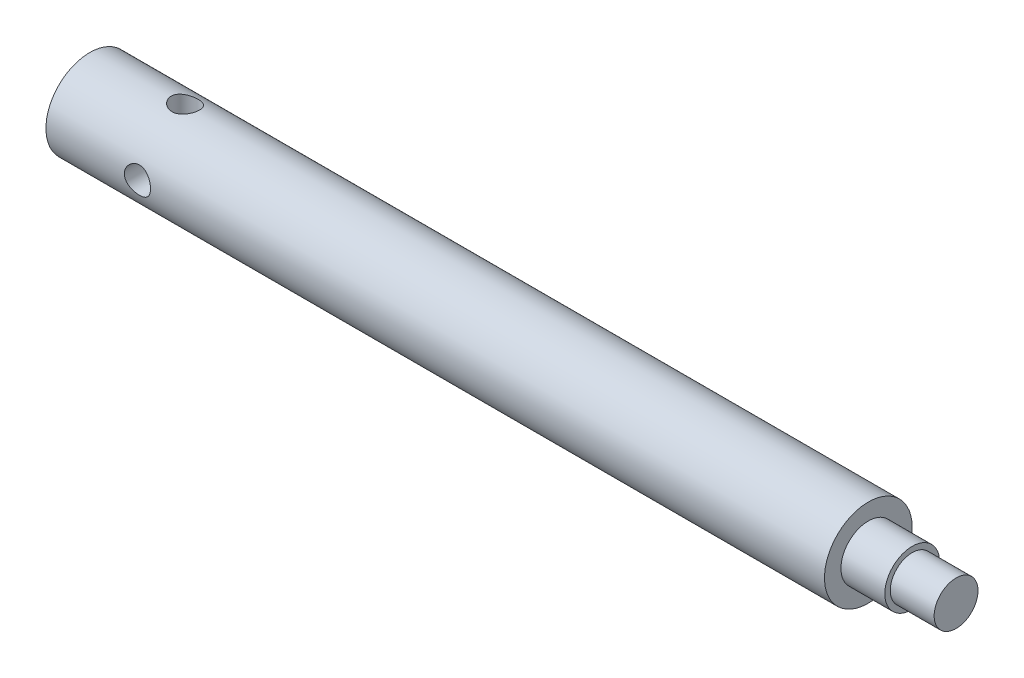
ISO-10303-21;
HEADER;
FILE_DESCRIPTION(('STEP AP214'),'2;1');
FILE_NAME('part.step','',(''),(''),'','','');
FILE_SCHEMA(('AUTOMOTIVE_DESIGN { 1 0 10303 214 1 1 1 1 }'));
ENDSEC;
DATA;
#1=APPLICATION_CONTEXT('core data for automotive mechanical design processes');
#2=APPLICATION_PROTOCOL_DEFINITION('international standard','automotive_design',2000,#1);
#3=PRODUCT_CONTEXT('',#1,'mechanical');
#4=PRODUCT('Part','Part','',(#3));
#5=PRODUCT_RELATED_PRODUCT_CATEGORY('part','',(#4));
#6=PRODUCT_DEFINITION_FORMATION('','',#4);
#7=PRODUCT_DEFINITION_CONTEXT('part definition',#1,'design');
#8=PRODUCT_DEFINITION('design','',#6,#7);
#9=PRODUCT_DEFINITION_SHAPE('','',#8);
#10=(LENGTH_UNIT() NAMED_UNIT(*) SI_UNIT(.MILLI.,.METRE.));
#11=(NAMED_UNIT(*) PLANE_ANGLE_UNIT() SI_UNIT($,.RADIAN.));
#12=(NAMED_UNIT(*) SI_UNIT($,.STERADIAN.) SOLID_ANGLE_UNIT());
#13=UNCERTAINTY_MEASURE_WITH_UNIT(LENGTH_MEASURE(1.E-05),#10,'distance_accuracy_value','');
#14=(GEOMETRIC_REPRESENTATION_CONTEXT(3) GLOBAL_UNCERTAINTY_ASSIGNED_CONTEXT((#13)) GLOBAL_UNIT_ASSIGNED_CONTEXT((#10,
#11,#12)) REPRESENTATION_CONTEXT('',''));
#15=CARTESIAN_POINT('',(0.,0.,0.));
#16=DIRECTION('',(0.,0.,1.));
#17=DIRECTION('',(1.,0.,0.));
#18=AXIS2_PLACEMENT_3D('',#15,#16,#17);
#19=CARTESIAN_POINT('',(112.7125,0.,-6.35));
#20=DIRECTION('',(1.,0.,0.));
#21=DIRECTION('',(0.,0.,-1.));
#22=AXIS2_PLACEMENT_3D('',#19,#20,#21);
#23=PLANE('',#22);
#24=CARTESIAN_POINT('',(112.7125,0.,-6.35));
#25=DIRECTION('',(1.,0.,0.));
#26=DIRECTION('',(0.,0.,-1.));
#27=AXIS2_PLACEMENT_3D('',#24,#25,#26);
#28=CIRCLE('',#27,6.35);
#29=CARTESIAN_POINT('',(112.7125,0.,-12.7));
#30=VERTEX_POINT('',#29);
#31=EDGE_CURVE('E59',#30,#30,#28,.T.);
#32=ORIENTED_EDGE('',*,*,#31,.T.);
#33=EDGE_LOOP('',(#32));
#34=FACE_BOUND('',#33,.T.);
#35=CARTESIAN_POINT('',(112.7125,0.,-6.35));
#36=DIRECTION('',(1.,0.,0.));
#37=DIRECTION('',(0.,0.,-1.));
#38=AXIS2_PLACEMENT_3D('',#35,#36,#37);
#39=CIRCLE('',#38,3.96875);
#40=CARTESIAN_POINT('',(112.7125,0.,-10.31875));
#41=VERTEX_POINT('',#40);
#42=EDGE_CURVE('E102',#41,#41,#39,.T.);
#43=ORIENTED_EDGE('',*,*,#42,.F.);
#44=EDGE_LOOP('',(#43));
#45=FACE_BOUND('',#44,.T.);
#46=ADVANCED_FACE('F33',(#34,#45),#23,.T.);
#47=CARTESIAN_POINT('',(125.4125,0.,-6.35));
#48=DIRECTION('',(-1.,0.,0.));
#49=DIRECTION('',(0.,0.,1.));
#50=AXIS2_PLACEMENT_3D('',#47,#48,#49);
#51=CYLINDRICAL_SURFACE('',#50,6.35);
#52=CARTESIAN_POINT('',(11.4266111207628,6.35,-6.35));
#53=CARTESIAN_POINT('',(11.4577336318271,6.34999938079552,-6.24937859823497));
#54=CARTESIAN_POINT('',(11.4972692572431,6.34758781302041,-6.15134137258519));
#55=CARTESIAN_POINT('',(11.5919759696863,6.33891479469025,-5.96329411162165));
#56=CARTESIAN_POINT('',(11.6471547225313,6.33265145483424,-5.87328804042741));
#57=CARTESIAN_POINT('',(11.7714400316176,6.31761759736355,-5.7039061466168));
#58=CARTESIAN_POINT('',(11.8405281436163,6.3088503935732,-5.62451647592833));
#59=CARTESIAN_POINT('',(11.9907851693866,6.29031494338255,-5.47828822830525));
#60=CARTESIAN_POINT('',(12.0719542994324,6.28054667906225,-5.41144987611273));
#61=CARTESIAN_POINT('',(12.2458296648951,6.26136939128791,-5.29096585613932));
#62=CARTESIAN_POINT('',(12.3387191327901,6.25197015362393,-5.23758269629433));
#63=CARTESIAN_POINT('',(12.5323069106344,6.23520397861584,-5.14714578522239));
#64=CARTESIAN_POINT('',(12.6330047371869,6.22783691559316,-5.11009102409106));
#65=CARTESIAN_POINT('',(12.8389100716101,6.2163191714203,-5.05357713222228));
#66=CARTESIAN_POINT('',(12.9440947576645,6.21215388178492,-5.03403801546134));
#67=CARTESIAN_POINT('',(13.1563266967063,6.20764142041926,-5.01291002509758));
#68=CARTESIAN_POINT('',(13.2633736998185,6.20729374036118,-5.01131876167585));
#69=CARTESIAN_POINT('',(13.4740321012668,6.21043739467487,-5.0259845403616));
#70=CARTESIAN_POINT('',(13.5776695170517,6.2138526598276,-5.04188791233877));
#71=CARTESIAN_POINT('',(13.7807690236843,6.22388174619111,-5.09047448294969));
#72=CARTESIAN_POINT('',(13.8802308633499,6.23049575952403,-5.12315868947552));
#73=CARTESIAN_POINT('',(14.0728053786898,6.24597207439229,-5.20455331581031));
#74=CARTESIAN_POINT('',(14.1658808004529,6.25484634379163,-5.2533494679003));
#75=CARTESIAN_POINT('',(14.3426602926947,6.27348564024486,-5.36556963532891));
#76=CARTESIAN_POINT('',(14.4263629906136,6.28325079738305,-5.42899578896233));
#77=CARTESIAN_POINT('',(14.5837877552712,6.30235159027388,-5.57023553587446));
#78=CARTESIAN_POINT('',(14.6572746082626,6.31167459897145,-5.64831338890576));
#79=CARTESIAN_POINT('',(14.7901546624977,6.32805537939198,-5.8158767231705));
#80=CARTESIAN_POINT('',(14.8495486464334,6.33511327692273,-5.90536157045598));
#81=CARTESIAN_POINT('',(14.9521084045542,6.34546736026181,-6.09258764855981));
#82=CARTESIAN_POINT('',(14.9953851299147,6.34878959502633,-6.19026653684177));
#83=CARTESIAN_POINT('',(15.0649403641985,6.35066036602646,-6.39153575540962));
#84=CARTESIAN_POINT('',(15.0912228965634,6.3492100326817,-6.49512468014643));
#85=CARTESIAN_POINT('',(15.1255128081798,6.34106082539388,-6.70190165162815));
#86=CARTESIAN_POINT('',(15.1340404463861,6.33451932644338,-6.80500999876491));
#87=CARTESIAN_POINT('',(15.1342963070305,6.31636961742326,-7.0107896830639));
#88=CARTESIAN_POINT('',(15.1260249191043,6.30476152487278,-7.11346103030653));
#89=CARTESIAN_POINT('',(15.0932382126614,6.27704410045209,-7.31517058765527));
#90=CARTESIAN_POINT('',(15.0687768980021,6.26094983582446,-7.41421972498404));
#91=CARTESIAN_POINT('',(15.0046039101863,6.22520161274166,-7.60656074901959));
#92=CARTESIAN_POINT('',(14.9648891531799,6.20554693488822,-7.69985146709371));
#93=CARTESIAN_POINT('',(14.8694982498852,6.1631171131665,-7.8821901611406));
#94=CARTESIAN_POINT('',(14.8132372698637,6.14024740565956,-7.97090999882731));
#95=CARTESIAN_POINT('',(14.6869836409434,6.09375664818138,-8.13777667191604));
#96=CARTESIAN_POINT('',(14.6169863239915,6.07013534508636,-8.21591989774568));
#97=CARTESIAN_POINT('',(14.4617645929628,6.02309317223907,-8.36271826028624));
#98=CARTESIAN_POINT('',(14.3760362302043,5.99971962327436,-8.43085752931546));
#99=CARTESIAN_POINT('',(14.1935080226986,5.95643936680531,-8.55169570445262));
#100=CARTESIAN_POINT('',(14.0967096104032,5.93653221159258,-8.6043966051319));
#101=CARTESIAN_POINT('',(13.8968559804477,5.90271348213745,-8.6914995979107));
#102=CARTESIAN_POINT('',(13.7939909251598,5.88867690277693,-8.72628730349392));
#103=CARTESIAN_POINT('',(13.5831692833253,5.86761140749185,-8.77784478693268));
#104=CARTESIAN_POINT('',(13.4752159440491,5.86057808394583,-8.79462589807022));
#105=CARTESIAN_POINT('',(13.265582982069,5.85461593976297,-8.8088657495357));
#106=CARTESIAN_POINT('',(13.1640047722765,5.85514507969129,-8.80761673051691));
#107=CARTESIAN_POINT('',(12.9626145005582,5.86293439061114,-8.78897530149262));
#108=CARTESIAN_POINT('',(12.8628023129154,5.87019408049761,-8.77158404534695));
#109=CARTESIAN_POINT('',(12.6700444572764,5.89041501742135,-8.72196105604408));
#110=CARTESIAN_POINT('',(12.5769938932286,5.90324190420398,-8.69007825767444));
#111=CARTESIAN_POINT('',(12.3975219933798,5.93333332564881,-8.61269121616237));
#112=CARTESIAN_POINT('',(12.3111022410739,5.9505989160554,-8.56718373196786));
#113=CARTESIAN_POINT('',(12.1421125556614,5.98913704360532,-8.46094676377473));
#114=CARTESIAN_POINT('',(12.0600269080799,6.01057946896043,-8.3995092963404));
#115=CARTESIAN_POINT('',(11.9069944298698,6.05494155684489,-8.26447889394705));
#116=CARTESIAN_POINT('',(11.8360515890103,6.0778617443741,-8.19088162434186));
#117=CARTESIAN_POINT('',(11.7028634412063,6.12480665255799,-8.0283381558019));
#118=CARTESIAN_POINT('',(11.6414207177869,6.14881267492132,-7.93872659181238));
#119=CARTESIAN_POINT('',(11.5345198773776,6.1945367443502,-7.74987259716872));
#120=CARTESIAN_POINT('',(11.4890628010988,6.21625464238791,-7.65062954001351));
#121=CARTESIAN_POINT('',(11.4157872039461,6.25567403647292,-7.44540785136356));
#122=CARTESIAN_POINT('',(11.387915412346,6.27338755724835,-7.33945064260707));
#123=CARTESIAN_POINT('',(11.3508214982671,6.30363614256627,-7.12363610958114));
#124=CARTESIAN_POINT('',(11.3415859965895,6.31617491696838,-7.01378164089424));
#125=CARTESIAN_POINT('',(11.3422796461399,6.33399532650036,-6.81025569023639));
#126=CARTESIAN_POINT('',(11.3495333292661,6.34008523426838,-6.71663728565326));
#127=CARTESIAN_POINT('',(11.3778366633614,6.34808771933512,-6.53132904521949));
#128=CARTESIAN_POINT('',(11.3988854721116,6.35000055162148,-6.43963909198584));
#129=CARTESIAN_POINT('',(11.4266111207628,6.35,-6.35));
#130=B_SPLINE_CURVE_WITH_KNOTS('',3,(#52,#53,#54,#55,#56,#57,#58,#59,#60,#61,#62,#63,#64,#65,
#66,#67,#68,#69,#70,#71,#72,#73,#74,#75,#76,#77,#78,#79,#80,#81,#82,#83,#84,#85,#86,#87,#88,#89,
#90,#91,#92,#93,#94,#95,#96,#97,#98,#99,#100,#101,#102,#103,#104,#105,#106,#107,#108,#109,#110,
#111,#112,#113,#114,#115,#116,#117,#118,#119,#120,#121,#122,#123,#124,#125,#126,#127,#128,#129),
.UNSPECIFIED.,.T.,.F.,(4,2,2,2,2,2,2,2,2,2,2,2,2,2,2,2,2,2,2,2,2,2,2,2,2,2,2,2,2,2,2,2,2,2,2,2,
2,2,4),(0.,0.315624618083841,0.631404174213591,0.946767722599156,1.26213691730055,
1.58325110966819,1.9043454384738,2.22396589307408,2.54354378859987,2.8567779144923,
3.17003085608406,3.48497823769007,3.79997168064208,4.12131504478002,4.44264055792013,
4.76171128222454,5.08070643760308,5.39021463984954,5.69971566346375,6.00818946958646,
6.31672567395976,6.63784336033515,6.95907036248635,7.29337655226682,7.62763953204613,
7.95436962831347,8.28089396106216,8.58413970145472,8.88736376727203,9.18364462802943,
9.47999602440948,9.79289229578643,10.1059003479742,10.4381469255259,10.7704151292708,
11.1016719054283,11.4326907839504,11.7138837600113,11.9950595702975),.UNSPECIFIED.);
#131=CARTESIAN_POINT('',(11.4266111207628,6.35,-6.35));
#132=VERTEX_POINT('',#131);
#133=EDGE_CURVE('E41',#132,#132,#130,.T.);
#134=ORIENTED_EDGE('',*,*,#133,.F.);
#135=EDGE_LOOP('',(#134));
#136=FACE_BOUND('',#135,.T.);
#137=CARTESIAN_POINT('',(15.14602,0.,0.));
#138=CARTESIAN_POINT('',(15.1460186784539,-0.104041263608736,-9.3198752666656E-07));
#139=CARTESIAN_POINT('',(15.137428338003,-0.208095902693064,-0.00258146369103132));
#140=CARTESIAN_POINT('',(15.1033745812206,-0.413176445435083,-0.0126236748043625));
#141=CARTESIAN_POINT('',(15.077905998013,-0.514201411727913,-0.0200868489111407));
#142=CARTESIAN_POINT('',(15.0110208913169,-0.710234900337256,-0.0390763229775592));
#143=CARTESIAN_POINT('',(14.9696277683707,-0.805252013548275,-0.0505966589915));
#144=CARTESIAN_POINT('',(14.8721641397141,-0.98699693549066,-0.0765021758659068));
#145=CARTESIAN_POINT('',(14.816091722151,-1.07372366246,-0.0908877298381138));
#146=CARTESIAN_POINT('',(14.6891789927061,-1.23889508361318,-0.121446377745115));
#147=CARTESIAN_POINT('',(14.6179969020367,-1.31707041949691,-0.137655846343183));
#148=CARTESIAN_POINT('',(14.463613961366,-1.46057039005766,-0.169817714807557));
#149=CARTESIAN_POINT('',(14.3804111156863,-1.52589288665249,-0.185770071498517));
#150=CARTESIAN_POINT('',(14.202075060823,-1.64324571157535,-0.215995794123321));
#151=CARTESIAN_POINT('',(14.1067176698892,-1.69494810443795,-0.230223927808608));
#152=CARTESIAN_POINT('',(13.908168415397,-1.78147351685527,-0.254846980180222));
#153=CARTESIAN_POINT('',(13.8049784201341,-1.81630054711363,-0.26524280953519));
#154=CARTESIAN_POINT('',(13.5967160509044,-1.86711690445795,-0.280645291997159));
#155=CARTESIAN_POINT('',(13.4917755126708,-1.88360246303717,-0.285793575907426));
#156=CARTESIAN_POINT('',(13.2805015885355,-1.89881735225442,-0.290539473118238));
#157=CARTESIAN_POINT('',(13.1741685426808,-1.89755093998074,-0.290138417202565));
#158=CARTESIAN_POINT('',(12.9671560506642,-1.87768778894682,-0.283956528585984));
#159=CARTESIAN_POINT('',(12.866410338643,-1.85971178087674,-0.278368396693788));
#160=CARTESIAN_POINT('',(12.6694352664604,-1.80794222338446,-0.262753607051625));
#161=CARTESIAN_POINT('',(12.5732063492875,-1.77414712604319,-0.252726514948663));
#162=CARTESIAN_POINT('',(12.3864737870838,-1.69123938923431,-0.229209139218736));
#163=CARTESIAN_POINT('',(12.2960657812657,-1.64192472161195,-0.215673619589847));
#164=CARTESIAN_POINT('',(12.1245999010747,-1.5295181447013,-0.186686357070703));
#165=CARTESIAN_POINT('',(12.0435442816839,-1.46642292330691,-0.171234153898949));
#166=CARTESIAN_POINT('',(11.8895622121004,-1.3251594247428,-0.139372169464676));
#167=CARTESIAN_POINT('',(11.817110510905,-1.24647574696514,-0.122949213242693));
#168=CARTESIAN_POINT('',(11.6863207171623,-1.07787079687547,-0.0915626848167651));
#169=CARTESIAN_POINT('',(11.6279834965435,-0.987948830833254,-0.0765992028065627));
#170=CARTESIAN_POINT('',(11.5267939654657,-0.7985626826595,-0.0496830955083949));
#171=CARTESIAN_POINT('',(11.4840461151632,-0.699039583591811,-0.0377509381389474));
#172=CARTESIAN_POINT('',(11.4160350882501,-0.493777723876315,-0.0183894105065017));
#173=CARTESIAN_POINT('',(11.390767081948,-0.388040688910151,-0.0109587965348804));
#174=CARTESIAN_POINT('',(11.3592213960881,-0.177389078590684,-0.00163391991362197));
#175=CARTESIAN_POINT('',(11.3523002061297,-0.0725790272140568,0.000447867662171515));
#176=CARTESIAN_POINT('',(11.3558421214665,0.136711373165987,-0.000609796122502279));
#177=CARTESIAN_POINT('',(11.3663029297853,0.241191763905088,-0.00374855760386107));
#178=CARTESIAN_POINT('',(11.4037912036675,0.444434024207722,-0.0147719529221267));
#179=CARTESIAN_POINT('',(11.4304434025527,0.543271498640539,-0.0225490127453378));
#180=CARTESIAN_POINT('',(11.4991070953167,0.735050922132964,-0.041949739106594));
#181=CARTESIAN_POINT('',(11.5411204291186,0.827992163389023,-0.053573866422168));
#182=CARTESIAN_POINT('',(11.6403989355269,1.00771449134107,-0.0797962877547255));
#183=CARTESIAN_POINT('',(11.6979925658501,1.09430481436618,-0.0944568183829414));
#184=CARTESIAN_POINT('',(11.8263970771037,1.25681124430027,-0.125068299411954));
#185=CARTESIAN_POINT('',(11.8972112408365,1.33272469179812,-0.141019569758879));
#186=CARTESIAN_POINT('',(12.053069420754,1.47455073596775,-0.173133189704937));
#187=CARTESIAN_POINT('',(12.1385335169344,1.54000562838576,-0.189282508331398));
#188=CARTESIAN_POINT('',(12.3195832116033,1.65567587636789,-0.219353868288971));
#189=CARTESIAN_POINT('',(12.4151685346157,1.70589164656163,-0.233275970213844));
#190=CARTESIAN_POINT('',(12.6134328917045,1.78931203012482,-0.257156011839271));
#191=CARTESIAN_POINT('',(12.7160756704556,1.82259714673245,-0.267132660295935));
#192=CARTESIAN_POINT('',(12.9258622111641,1.87131281496002,-0.281940248068837));
#193=CARTESIAN_POINT('',(13.0330044361517,1.88674941288061,-0.286772929892814));
#194=CARTESIAN_POINT('',(13.243996810824,1.89892144583726,-0.290574864100528));
#195=CARTESIAN_POINT('',(13.3478002984393,1.89640251159423,-0.289777908496873));
#196=CARTESIAN_POINT('',(13.5534319583954,1.87451259332701,-0.282971814886209));
#197=CARTESIAN_POINT('',(13.6552602083056,1.8551422724474,-0.276962881983682));
#198=CARTESIAN_POINT('',(13.8528444128517,1.80057873879551,-0.260565975898137));
#199=CARTESIAN_POINT('',(13.9486592411983,1.76558121150248,-0.250232255588887));
#200=CARTESIAN_POINT('',(14.1331336374944,1.68090893665019,-0.226359640969271));
#201=CARTESIAN_POINT('',(14.2217918417466,1.631231400176,-0.212820137720015));
#202=CARTESIAN_POINT('',(14.3929008349148,1.51650738060921,-0.183450985488597));
#203=CARTESIAN_POINT('',(14.4750116552927,1.45097050063723,-0.167556271621904));
#204=CARTESIAN_POINT('',(14.6273119857414,1.30727302170371,-0.135585551124375));
#205=CARTESIAN_POINT('',(14.6974984030731,1.22910915800394,-0.119509498610564));
#206=CARTESIAN_POINT('',(14.825975747091,1.05965843653239,-0.0884310926443148));
#207=CARTESIAN_POINT('',(14.8838647703362,0.968057875485295,-0.0734731336261888));
#208=CARTESIAN_POINT('',(14.9833389875982,0.7759774354411,-0.0468471859124134));
#209=CARTESIAN_POINT('',(15.0249319377451,0.67550180851272,-0.0351776328414613));
#210=CARTESIAN_POINT('',(15.0868281807094,0.479903479002752,-0.0174840605556105));
#211=CARTESIAN_POINT('',(15.1089653579598,0.385401243233201,-0.0109814269972653));
#212=CARTESIAN_POINT('',(15.1385606830133,0.193936274942226,-0.00223931102761202));
#213=CARTESIAN_POINT('',(15.1460212317761,0.0969739474981097,8.68679467598715E-07));
#214=CARTESIAN_POINT('',(15.14602,0.,0.));
#215=B_SPLINE_CURVE_WITH_KNOTS('',3,(#137,#138,#139,#140,#141,#142,#143,#144,#145,#146,#147,
#148,#149,#150,#151,#152,#153,#154,#155,#156,#157,#158,#159,#160,#161,#162,#163,#164,#165,#166,
#167,#168,#169,#170,#171,#172,#173,#174,#175,#176,#177,#178,#179,#180,#181,#182,#183,#184,#185,
#186,#187,#188,#189,#190,#191,#192,#193,#194,#195,#196,#197,#198,#199,#200,#201,#202,#203,#204,
#205,#206,#207,#208,#209,#210,#211,#212,#213,#214),.UNSPECIFIED.,.T.,.F.,(4,2,2,2,2,2,2,2,2,2,2,
2,2,2,2,2,2,2,2,2,2,2,2,2,2,2,2,2,2,2,2,2,2,2,2,2,2,2,4),(0.,0.311767609487159,
0.623630703394822,0.93503726533525,1.24648440551488,1.56591685455035,1.88540239663912,
2.21199345471405,2.53850685500877,2.85595363226556,3.173324284125,3.47935707922044,
3.78541982629694,4.09564418333228,4.40594318387775,4.72907340643705,5.05222358541818,
5.37750096057737,5.70268842546386,6.01630908213325,6.32988829811373,6.63646313337687,
6.94307470154101,7.25673581461779,7.57047491700412,7.89549421739937,8.22050467380002,
8.54395494911829,8.86729562144096,9.17728969490987,9.48727156988179,9.79347617211729,
10.0997389846848,10.4170661560871,10.7344755049252,11.061048100797,11.3874650747893,
11.6781024801616,11.9686923360071),.UNSPECIFIED.);
#216=CARTESIAN_POINT('',(15.14602,0.,0.));
#217=VERTEX_POINT('',#216);
#218=EDGE_CURVE('E45',#217,#217,#215,.T.);
#219=ORIENTED_EDGE('',*,*,#218,.T.);
#220=EDGE_LOOP('',(#219));
#221=FACE_BOUND('',#220,.T.);
#222=CARTESIAN_POINT('',(0.,0.,-6.35));
#223=DIRECTION('',(1.,0.,0.));
#224=DIRECTION('',(0.,0.,-1.));
#225=AXIS2_PLACEMENT_3D('',#222,#223,#224);
#226=CIRCLE('',#225,6.35);
#227=CARTESIAN_POINT('',(0.,0.,-12.7));
#228=VERTEX_POINT('',#227);
#229=EDGE_CURVE('E50',#228,#228,#226,.T.);
#230=ORIENTED_EDGE('',*,*,#229,.T.);
#231=EDGE_LOOP('',(#230));
#232=FACE_BOUND('',#231,.T.);
#233=ORIENTED_EDGE('',*,*,#31,.F.);
#234=EDGE_LOOP('',(#233));
#235=FACE_BOUND('',#234,.T.);
#236=ADVANCED_FACE('F35',(#136,#221,#232,#235),#51,.T.);
#237=CARTESIAN_POINT('',(0.,0.,-6.35));
#238=DIRECTION('',(1.,0.,0.));
#239=DIRECTION('',(0.,0.,-1.));
#240=AXIS2_PLACEMENT_3D('',#237,#238,#239);
#241=PLANE('',#240);
#242=ORIENTED_EDGE('',*,*,#229,.F.);
#243=EDGE_LOOP('',(#242));
#244=FACE_BOUND('',#243,.T.);
#245=ADVANCED_FACE('F79',(#244),#241,.F.);
#246=CARTESIAN_POINT('',(13.24991,0.,-3.175));
#247=DIRECTION('',(0.,0.,1.));
#248=DIRECTION('',(1.,0.,0.));
#249=AXIS2_PLACEMENT_3D('',#246,#247,#248);
#250=CYLINDRICAL_SURFACE('',#249,1.89611);
#251=CARTESIAN_POINT('',(13.24991,0.,-3.175));
#252=DIRECTION('',(0.,0.,1.));
#253=DIRECTION('',(1.,0.,0.));
#254=AXIS2_PLACEMENT_3D('',#251,#252,#253);
#255=CIRCLE('',#254,1.89611);
#256=CARTESIAN_POINT('',(15.14602,0.,-3.175));
#257=VERTEX_POINT('',#256);
#258=EDGE_CURVE('E115',#257,#257,#255,.T.);
#259=ORIENTED_EDGE('',*,*,#258,.F.);
#260=EDGE_LOOP('',(#259));
#261=FACE_BOUND('',#260,.T.);
#262=ORIENTED_EDGE('',*,*,#218,.F.);
#263=EDGE_LOOP('',(#262));
#264=FACE_BOUND('',#263,.T.);
#265=ADVANCED_FACE('F74',(#261,#264),#250,.F.);
#266=CARTESIAN_POINT('',(13.24991,0.,-3.175));
#267=DIRECTION('',(0.,0.,1.));
#268=DIRECTION('',(1.,0.,0.));
#269=AXIS2_PLACEMENT_3D('',#266,#267,#268);
#270=PLANE('',#269);
#271=ORIENTED_EDGE('',*,*,#258,.T.);
#272=EDGE_LOOP('',(#271));
#273=FACE_BOUND('',#272,.T.);
#274=ADVANCED_FACE('F66',(#273),#270,.T.);
#275=CARTESIAN_POINT('',(13.2380598404816,6.35,-6.91025589504186));
#276=DIRECTION('',(0.,-1.,0.));
#277=DIRECTION('',(0.,0.,-1.));
#278=AXIS2_PLACEMENT_3D('',#275,#276,#277);
#279=CYLINDRICAL_SURFACE('',#278,1.89611);
#280=CARTESIAN_POINT('',(13.2380598404816,3.175,-6.91025589504186));
#281=DIRECTION('',(0.,1.,0.));
#282=DIRECTION('',(0.,0.,1.));
#283=AXIS2_PLACEMENT_3D('',#280,#281,#282);
#284=CIRCLE('',#283,1.89611);
#285=CARTESIAN_POINT('',(13.2380598404816,3.175,-5.01414589504186));
#286=VERTEX_POINT('',#285);
#287=EDGE_CURVE('E112',#286,#286,#284,.T.);
#288=ORIENTED_EDGE('',*,*,#287,.F.);
#289=EDGE_LOOP('',(#288));
#290=FACE_BOUND('',#289,.T.);
#291=ORIENTED_EDGE('',*,*,#133,.T.);
#292=EDGE_LOOP('',(#291));
#293=FACE_BOUND('',#292,.T.);
#294=ADVANCED_FACE('F60',(#290,#293),#279,.F.);
#295=CARTESIAN_POINT('',(0.,3.175,0.));
#296=DIRECTION('',(0.,-1.,0.));
#297=DIRECTION('',(0.,0.,-1.));
#298=AXIS2_PLACEMENT_3D('',#295,#296,#297);
#299=PLANE('',#298);
#300=ORIENTED_EDGE('',*,*,#287,.T.);
#301=EDGE_LOOP('',(#300));
#302=FACE_BOUND('',#301,.T.);
#303=ADVANCED_FACE('F65',(#302),#299,.F.);
#304=CARTESIAN_POINT('',(119.0625,0.,-6.35));
#305=DIRECTION('',(-1.,0.,0.));
#306=DIRECTION('',(0.,0.,1.));
#307=AXIS2_PLACEMENT_3D('',#304,#305,#306);
#308=CYLINDRICAL_SURFACE('',#307,3.96875);
#309=CARTESIAN_POINT('',(119.0625,0.,-6.35));
#310=DIRECTION('',(1.,0.,0.));
#311=DIRECTION('',(0.,0.,-1.));
#312=AXIS2_PLACEMENT_3D('',#309,#310,#311);
#313=CIRCLE('',#312,3.96875);
#314=CARTESIAN_POINT('',(119.0625,0.,-10.31875));
#315=VERTEX_POINT('',#314);
#316=EDGE_CURVE('E104',#315,#315,#313,.T.);
#317=ORIENTED_EDGE('',*,*,#316,.F.);
#318=EDGE_LOOP('',(#317));
#319=FACE_BOUND('',#318,.T.);
#320=ORIENTED_EDGE('',*,*,#42,.T.);
#321=EDGE_LOOP('',(#320));
#322=FACE_BOUND('',#321,.T.);
#323=ADVANCED_FACE('F71',(#319,#322),#308,.T.);
#324=CARTESIAN_POINT('',(119.0625,0.,-6.35));
#325=DIRECTION('',(1.,0.,0.));
#326=DIRECTION('',(0.,0.,-1.));
#327=AXIS2_PLACEMENT_3D('',#324,#325,#326);
#328=PLANE('',#327);
#329=CARTESIAN_POINT('',(119.0625,0.,-6.35));
#330=DIRECTION('',(1.,0.,0.));
#331=DIRECTION('',(0.,0.,-1.));
#332=AXIS2_PLACEMENT_3D('',#329,#330,#331);
#333=CIRCLE('',#332,3.175);
#334=CARTESIAN_POINT('',(119.0625,0.,-9.525));
#335=VERTEX_POINT('',#334);
#336=EDGE_CURVE('E11',#335,#335,#333,.F.);
#337=ORIENTED_EDGE('',*,*,#336,.T.);
#338=EDGE_LOOP('',(#337));
#339=FACE_BOUND('',#338,.T.);
#340=ORIENTED_EDGE('',*,*,#316,.T.);
#341=EDGE_LOOP('',(#340));
#342=FACE_BOUND('',#341,.T.);
#343=ADVANCED_FACE('F84',(#339,#342),#328,.T.);
#344=CARTESIAN_POINT('',(125.4125,0.,-6.35));
#345=DIRECTION('',(1.,0.,0.));
#346=DIRECTION('',(0.,0.,-1.));
#347=AXIS2_PLACEMENT_3D('',#344,#345,#346);
#348=PLANE('',#347);
#349=CARTESIAN_POINT('',(125.4125,0.,-6.35));
#350=DIRECTION('',(1.,0.,0.));
#351=DIRECTION('',(0.,0.,-1.));
#352=AXIS2_PLACEMENT_3D('',#349,#350,#351);
#353=CIRCLE('',#352,3.175);
#354=CARTESIAN_POINT('',(125.4125,0.,-9.525));
#355=VERTEX_POINT('',#354);
#356=EDGE_CURVE('E107',#355,#355,#353,.T.);
#357=ORIENTED_EDGE('',*,*,#356,.T.);
#358=EDGE_LOOP('',(#357));
#359=FACE_BOUND('',#358,.T.);
#360=ADVANCED_FACE('F81',(#359),#348,.T.);
#361=CARTESIAN_POINT('',(112.7125,0.,-6.35));
#362=DIRECTION('',(1.,0.,0.));
#363=DIRECTION('',(0.,0.,-1.));
#364=AXIS2_PLACEMENT_3D('',#361,#362,#363);
#365=CYLINDRICAL_SURFACE('',#364,3.175);
#366=ORIENTED_EDGE('',*,*,#336,.F.);
#367=EDGE_LOOP('',(#366));
#368=FACE_BOUND('',#367,.T.);
#369=ORIENTED_EDGE('',*,*,#356,.F.);
#370=EDGE_LOOP('',(#369));
#371=FACE_BOUND('',#370,.T.);
#372=ADVANCED_FACE('F83',(#368,#371),#365,.T.);
#373=CLOSED_SHELL('',(#46,#236,#245,#265,#274,#294,#303,#323,#343,#360,#372));
#374=MANIFOLD_SOLID_BREP('B2',#373);
#375=ADVANCED_BREP_SHAPE_REPRESENTATION('',(#18,#374),#14);
#376=SHAPE_DEFINITION_REPRESENTATION(#9,#375);
ENDSEC;
END-ISO-10303-21;
